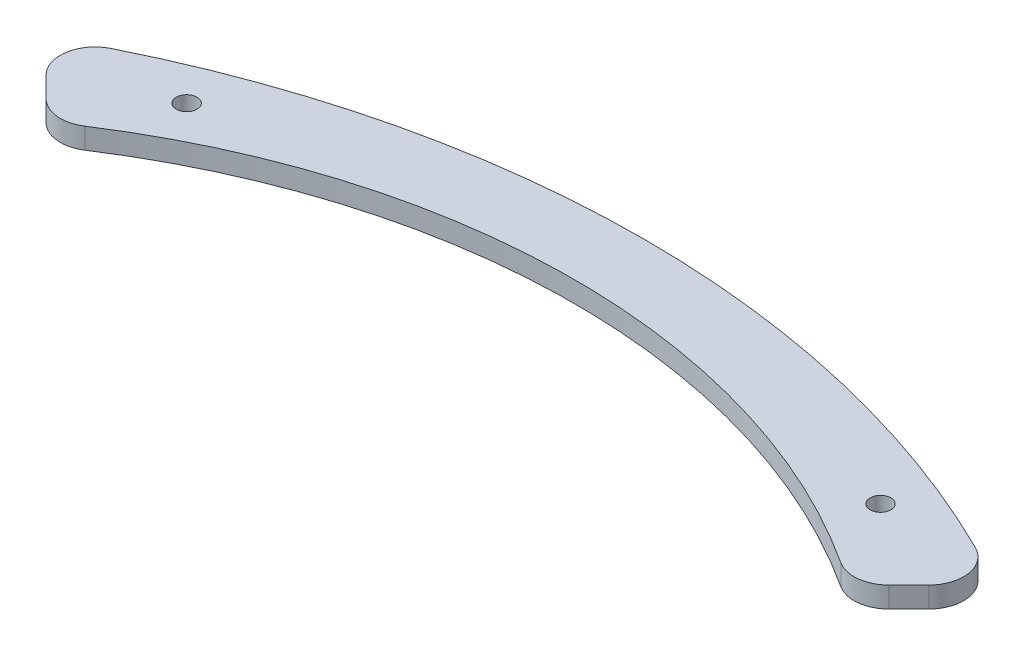
ISO-10303-21;
HEADER;
FILE_DESCRIPTION(('STEP AP214'),'2;1');
FILE_NAME('part.step','',(''),(''),'','','');
FILE_SCHEMA(('AUTOMOTIVE_DESIGN { 1 0 10303 214 1 1 1 1 }'));
ENDSEC;
DATA;
#1=APPLICATION_CONTEXT('core data for automotive mechanical design processes');
#2=APPLICATION_PROTOCOL_DEFINITION('international standard','automotive_design',2000,#1);
#3=PRODUCT_CONTEXT('',#1,'mechanical');
#4=PRODUCT('Part','Part','',(#3));
#5=PRODUCT_RELATED_PRODUCT_CATEGORY('part','',(#4));
#6=PRODUCT_DEFINITION_FORMATION('','',#4);
#7=PRODUCT_DEFINITION_CONTEXT('part definition',#1,'design');
#8=PRODUCT_DEFINITION('design','',#6,#7);
#9=PRODUCT_DEFINITION_SHAPE('','',#8);
#10=(LENGTH_UNIT() NAMED_UNIT(*) SI_UNIT(.MILLI.,.METRE.));
#11=(NAMED_UNIT(*) PLANE_ANGLE_UNIT() SI_UNIT($,.RADIAN.));
#12=(NAMED_UNIT(*) SI_UNIT($,.STERADIAN.) SOLID_ANGLE_UNIT());
#13=UNCERTAINTY_MEASURE_WITH_UNIT(LENGTH_MEASURE(1.E-05),#10,'distance_accuracy_value','');
#14=(GEOMETRIC_REPRESENTATION_CONTEXT(3) GLOBAL_UNCERTAINTY_ASSIGNED_CONTEXT((#13)) GLOBAL_UNIT_ASSIGNED_CONTEXT((#10,
#11,#12)) REPRESENTATION_CONTEXT('',''));
#15=CARTESIAN_POINT('',(0.,0.,0.));
#16=DIRECTION('',(0.,0.,1.));
#17=DIRECTION('',(1.,0.,0.));
#18=AXIS2_PLACEMENT_3D('',#15,#16,#17);
#19=CARTESIAN_POINT('',(0.,3.,0.));
#20=DIRECTION('',(0.,-1.,0.));
#21=DIRECTION('',(0.,0.,-1.));
#22=AXIS2_PLACEMENT_3D('',#19,#20,#21);
#23=CYLINDRICAL_SURFACE('',#22,140.);
#24=CARTESIAN_POINT('',(0.,3.,0.));
#25=DIRECTION('',(0.,1.,0.));
#26=DIRECTION('',(0.,0.,-1.));
#27=AXIS2_PLACEMENT_3D('',#24,#25,#26);
#28=CIRCLE('',#27,140.);
#29=CARTESIAN_POINT('',(62.3072350090684,3.,-125.370684234891));
#30=VERTEX_POINT('',#29);
#31=CARTESIAN_POINT('',(-62.3072350090685,3.,-125.370684234891));
#32=VERTEX_POINT('',#31);
#33=EDGE_CURVE('E118',#30,#32,#28,.T.);
#34=ORIENTED_EDGE('',*,*,#33,.F.);
#35=DIRECTION('',(0.,-1.,0.));
#36=VECTOR('',#35,1.);
#37=CARTESIAN_POINT('',(62.3072350090683,3.,-125.370684234891));
#38=LINE('',#37,#36);
#39=CARTESIAN_POINT('',(62.3072350090684,0.,-125.370684234891));
#40=VERTEX_POINT('',#39);
#41=EDGE_CURVE('E103',#30,#40,#38,.T.);
#42=ORIENTED_EDGE('',*,*,#41,.T.);
#43=CARTESIAN_POINT('',(0.,0.,0.));
#44=DIRECTION('',(0.,1.,0.));
#45=DIRECTION('',(0.,0.,-1.));
#46=AXIS2_PLACEMENT_3D('',#43,#44,#45);
#47=CIRCLE('',#46,140.);
#48=CARTESIAN_POINT('',(-62.3072350090685,0.,-125.370684234891));
#49=VERTEX_POINT('',#48);
#50=EDGE_CURVE('E115',#40,#49,#47,.T.);
#51=ORIENTED_EDGE('',*,*,#50,.T.);
#52=DIRECTION('',(0.,-1.,0.));
#53=VECTOR('',#52,1.);
#54=CARTESIAN_POINT('',(-62.3072350090685,3.,-125.370684234891));
#55=LINE('',#54,#53);
#56=EDGE_CURVE('E120',#49,#32,#55,.F.);
#57=ORIENTED_EDGE('',*,*,#56,.T.);
#58=EDGE_LOOP('',(#34,#42,#51,#57));
#59=FACE_BOUND('',#58,.T.);
#60=ADVANCED_FACE('F32',(#59),#23,.T.);
#61=CARTESIAN_POINT('',(-68.4084813465316,3.,-122.148596716709));
#62=DIRECTION('',(0.707106781186547,0.,-0.707106781186547));
#63=DIRECTION('',(-0.707106781186548,0.,-0.707106781186548));
#64=AXIS2_PLACEMENT_3D('',#61,#62,#63);
#65=PLANE('',#64);
#66=DIRECTION('',(0.707106781186548,0.,0.707106781186548));
#67=VECTOR('',#66,1.);
#68=CARTESIAN_POINT('',(-68.4084813465316,3.,-122.148596716709));
#69=LINE('',#68,#67);
#70=CARTESIAN_POINT('',(-63.6175105218202,3.,-117.357625891998));
#71=VERTEX_POINT('',#70);
#72=CARTESIAN_POINT('',(-60.7237103959211,3.,-114.463825766099));
#73=VERTEX_POINT('',#72);
#74=EDGE_CURVE('E162',#71,#73,#69,.T.);
#75=ORIENTED_EDGE('',*,*,#74,.F.);
#76=DIRECTION('',(0.,-1.,0.));
#77=VECTOR('',#76,1.);
#78=CARTESIAN_POINT('',(-63.6175105218202,3.,-117.357625891998));
#79=LINE('',#78,#77);
#80=CARTESIAN_POINT('',(-63.6175105218202,0.,-117.357625891998));
#81=VERTEX_POINT('',#80);
#82=EDGE_CURVE('E11',#71,#81,#79,.T.);
#83=ORIENTED_EDGE('',*,*,#82,.T.);
#84=DIRECTION('',(0.707106781186548,0.,0.707106781186548));
#85=VECTOR('',#84,1.);
#86=CARTESIAN_POINT('',(-68.4084813465316,0.,-122.148596716709));
#87=LINE('',#86,#85);
#88=CARTESIAN_POINT('',(-60.7237103959211,0.,-114.463825766099));
#89=VERTEX_POINT('',#88);
#90=EDGE_CURVE('E125',#81,#89,#87,.T.);
#91=ORIENTED_EDGE('',*,*,#90,.T.);
#92=DIRECTION('',(0.,-1.,0.));
#93=VECTOR('',#92,1.);
#94=CARTESIAN_POINT('',(-60.7237103959211,3.,-114.463825766099));
#95=LINE('',#94,#93);
#96=EDGE_CURVE('E40',#89,#73,#95,.F.);
#97=ORIENTED_EDGE('',*,*,#96,.T.);
#98=EDGE_LOOP('',(#75,#83,#91,#97));
#99=FACE_BOUND('',#98,.T.);
#100=ADVANCED_FACE('F161',(#99),#65,.F.);
#101=CARTESIAN_POINT('',(0.,3.,-29.9396499873524));
#102=DIRECTION('',(0.,-1.,0.));
#103=DIRECTION('',(0.,0.,-1.));
#104=AXIS2_PLACEMENT_3D('',#101,#102,#103);
#105=CYLINDRICAL_SURFACE('',#104,100.);
#106=CARTESIAN_POINT('',(0.,0.,-29.9396499873524));
#107=DIRECTION('',(0.,-1.,0.));
#108=DIRECTION('',(0.,0.,-1.));
#109=AXIS2_PLACEMENT_3D('',#106,#107,#108);
#110=CIRCLE('',#109,100.);
#111=CARTESIAN_POINT('',(-54.4649299904651,0.,-113.806040163237));
#112=VERTEX_POINT('',#111);
#113=CARTESIAN_POINT('',(54.4649299904651,0.,-113.806040163237));
#114=VERTEX_POINT('',#113);
#115=EDGE_CURVE('E129',#112,#114,#110,.T.);
#116=ORIENTED_EDGE('',*,*,#115,.T.);
#117=DIRECTION('',(0.,-1.,0.));
#118=VECTOR('',#117,1.);
#119=CARTESIAN_POINT('',(54.4649299904651,3.,-113.806040163237));
#120=LINE('',#119,#118);
#121=CARTESIAN_POINT('',(54.4649299904651,3.,-113.806040163237));
#122=VERTEX_POINT('',#121);
#123=EDGE_CURVE('E47',#114,#122,#120,.F.);
#124=ORIENTED_EDGE('',*,*,#123,.T.);
#125=CARTESIAN_POINT('',(0.,3.,-29.9396499873524));
#126=DIRECTION('',(0.,-1.,0.));
#127=DIRECTION('',(0.,0.,-1.));
#128=AXIS2_PLACEMENT_3D('',#125,#126,#127);
#129=CIRCLE('',#128,100.);
#130=CARTESIAN_POINT('',(-54.4649299904651,3.,-113.806040163237));
#131=VERTEX_POINT('',#130);
#132=EDGE_CURVE('E168',#131,#122,#129,.T.);
#133=ORIENTED_EDGE('',*,*,#132,.F.);
#134=DIRECTION('',(0.,-1.,0.));
#135=VECTOR('',#134,1.);
#136=CARTESIAN_POINT('',(-54.4649299904651,3.,-113.806040163237));
#137=LINE('',#136,#135);
#138=EDGE_CURVE('E155',#131,#112,#137,.T.);
#139=ORIENTED_EDGE('',*,*,#138,.T.);
#140=EDGE_LOOP('',(#116,#124,#133,#139));
#141=FACE_BOUND('',#140,.T.);
#142=ADVANCED_FACE('F172',(#141),#105,.F.);
#143=CARTESIAN_POINT('',(68.4084813465315,3.,-122.148596716709));
#144=DIRECTION('',(-0.707106781186549,0.,-0.707106781186546));
#145=DIRECTION('',(-0.707106781186546,0.,0.707106781186549));
#146=AXIS2_PLACEMENT_3D('',#143,#144,#145);
#147=PLANE('',#146);
#148=DIRECTION('',(0.707106781186546,0.,-0.707106781186549));
#149=VECTOR('',#148,1.);
#150=CARTESIAN_POINT('',(68.4084813465315,0.,-122.148596716709));
#151=LINE('',#150,#149);
#152=CARTESIAN_POINT('',(60.723710395921,0.,-114.463825766099));
#153=VERTEX_POINT('',#152);
#154=CARTESIAN_POINT('',(63.6175105218201,0.,-117.357625891998));
#155=VERTEX_POINT('',#154);
#156=EDGE_CURVE('E139',#153,#155,#151,.T.);
#157=ORIENTED_EDGE('',*,*,#156,.T.);
#158=DIRECTION('',(0.,-1.,0.));
#159=VECTOR('',#158,1.);
#160=CARTESIAN_POINT('',(63.6175105218201,3.,-117.357625891998));
#161=LINE('',#160,#159);
#162=CARTESIAN_POINT('',(63.6175105218201,3.,-117.357625891998));
#163=VERTEX_POINT('',#162);
#164=EDGE_CURVE('E104',#155,#163,#161,.F.);
#165=ORIENTED_EDGE('',*,*,#164,.T.);
#166=DIRECTION('',(0.707106781186546,0.,-0.707106781186549));
#167=VECTOR('',#166,1.);
#168=CARTESIAN_POINT('',(68.4084813465315,3.,-122.148596716709));
#169=LINE('',#168,#167);
#170=CARTESIAN_POINT('',(60.723710395921,3.,-114.463825766099));
#171=VERTEX_POINT('',#170);
#172=EDGE_CURVE('E135',#171,#163,#169,.T.);
#173=ORIENTED_EDGE('',*,*,#172,.F.);
#174=DIRECTION('',(0.,-1.,0.));
#175=VECTOR('',#174,1.);
#176=CARTESIAN_POINT('',(60.723710395921,3.,-114.463825766099));
#177=LINE('',#176,#175);
#178=EDGE_CURVE('E109',#171,#153,#177,.T.);
#179=ORIENTED_EDGE('',*,*,#178,.T.);
#180=EDGE_LOOP('',(#157,#165,#173,#179));
#181=FACE_BOUND('',#180,.T.);
#182=ADVANCED_FACE('F179',(#181),#147,.F.);
#183=CARTESIAN_POINT('',(0.,3.,0.));
#184=DIRECTION('',(0.,-1.,0.));
#185=DIRECTION('',(0.,0.,-1.));
#186=AXIS2_PLACEMENT_3D('',#183,#184,#185);
#187=PLANE('',#186);
#188=CARTESIAN_POINT('',(50.,3.,-124.));
#189=DIRECTION('',(0.,1.,0.));
#190=DIRECTION('',(0.,0.,1.));
#191=AXIS2_PLACEMENT_3D('',#188,#189,#190);
#192=CIRCLE('',#191,1.5);
#193=CARTESIAN_POINT('',(50.,3.,-122.5));
#194=VERTEX_POINT('',#193);
#195=EDGE_CURVE('E183',#194,#194,#192,.T.);
#196=ORIENTED_EDGE('',*,*,#195,.F.);
#197=EDGE_LOOP('',(#196));
#198=FACE_BOUND('',#197,.T.);
#199=CARTESIAN_POINT('',(-50.,3.,-124.));
#200=DIRECTION('',(0.,1.,0.));
#201=DIRECTION('',(0.,0.,1.));
#202=AXIS2_PLACEMENT_3D('',#199,#200,#201);
#203=CIRCLE('',#202,1.5);
#204=CARTESIAN_POINT('',(-50.,3.,-122.5));
#205=VERTEX_POINT('',#204);
#206=EDGE_CURVE('E126',#205,#205,#203,.T.);
#207=ORIENTED_EDGE('',*,*,#206,.F.);
#208=EDGE_LOOP('',(#207));
#209=FACE_BOUND('',#208,.T.);
#210=ORIENTED_EDGE('',*,*,#172,.T.);
#211=CARTESIAN_POINT('',(60.0819766158873,3.,-120.89315979793));
#212=DIRECTION('',(0.,-1.,0.));
#213=DIRECTION('',(0.,0.,-1.));
#214=AXIS2_PLACEMENT_3D('',#211,#212,#213);
#215=CIRCLE('',#214,5.);
#216=EDGE_CURVE('E153',#163,#30,#215,.F.);
#217=ORIENTED_EDGE('',*,*,#216,.T.);
#218=ORIENTED_EDGE('',*,*,#33,.T.);
#219=CARTESIAN_POINT('',(-60.0819766158874,3.,-120.89315979793));
#220=DIRECTION('',(0.,-1.,0.));
#221=DIRECTION('',(0.,0.,-1.));
#222=AXIS2_PLACEMENT_3D('',#219,#220,#221);
#223=CIRCLE('',#222,5.);
#224=EDGE_CURVE('E149',#32,#71,#223,.F.);
#225=ORIENTED_EDGE('',*,*,#224,.T.);
#226=ORIENTED_EDGE('',*,*,#74,.T.);
#227=CARTESIAN_POINT('',(-57.1881764899884,3.,-117.999359672031));
#228=DIRECTION('',(0.,-1.,0.));
#229=DIRECTION('',(0.,0.,-1.));
#230=AXIS2_PLACEMENT_3D('',#227,#228,#229);
#231=CIRCLE('',#230,5.);
#232=EDGE_CURVE('E54',#73,#131,#231,.F.);
#233=ORIENTED_EDGE('',*,*,#232,.T.);
#234=ORIENTED_EDGE('',*,*,#132,.T.);
#235=CARTESIAN_POINT('',(57.1881764899883,3.,-117.999359672031));
#236=DIRECTION('',(0.,-1.,0.));
#237=DIRECTION('',(0.,0.,-1.));
#238=AXIS2_PLACEMENT_3D('',#235,#236,#237);
#239=CIRCLE('',#238,5.);
#240=EDGE_CURVE('E151',#122,#171,#239,.F.);
#241=ORIENTED_EDGE('',*,*,#240,.T.);
#242=EDGE_LOOP('',(#210,#217,#218,#225,#226,#233,#234,#241));
#243=FACE_BOUND('',#242,.T.);
#244=ADVANCED_FACE('F166',(#198,#209,#243),#187,.F.);
#245=CARTESIAN_POINT('',(0.,0.,0.));
#246=DIRECTION('',(0.,-1.,0.));
#247=DIRECTION('',(0.,0.,-1.));
#248=AXIS2_PLACEMENT_3D('',#245,#246,#247);
#249=PLANE('',#248);
#250=CARTESIAN_POINT('',(50.,0.,-124.));
#251=DIRECTION('',(0.,-1.,0.));
#252=DIRECTION('',(0.,0.,-1.));
#253=AXIS2_PLACEMENT_3D('',#250,#251,#252);
#254=CIRCLE('',#253,1.5);
#255=CARTESIAN_POINT('',(50.,0.,-122.5));
#256=VERTEX_POINT('',#255);
#257=EDGE_CURVE('E185',#256,#256,#254,.F.);
#258=ORIENTED_EDGE('',*,*,#257,.T.);
#259=EDGE_LOOP('',(#258));
#260=FACE_BOUND('',#259,.T.);
#261=CARTESIAN_POINT('',(-50.,0.,-124.));
#262=DIRECTION('',(0.,-1.,0.));
#263=DIRECTION('',(0.,0.,-1.));
#264=AXIS2_PLACEMENT_3D('',#261,#262,#263);
#265=CIRCLE('',#264,1.5);
#266=CARTESIAN_POINT('',(-50.,0.,-122.5));
#267=VERTEX_POINT('',#266);
#268=EDGE_CURVE('E132',#267,#267,#265,.F.);
#269=ORIENTED_EDGE('',*,*,#268,.T.);
#270=EDGE_LOOP('',(#269));
#271=FACE_BOUND('',#270,.T.);
#272=ORIENTED_EDGE('',*,*,#50,.F.);
#273=CARTESIAN_POINT('',(60.0819766158873,0.,-120.89315979793));
#274=DIRECTION('',(0.,-1.,0.));
#275=DIRECTION('',(0.,0.,-1.));
#276=AXIS2_PLACEMENT_3D('',#273,#274,#275);
#277=CIRCLE('',#276,5.);
#278=EDGE_CURVE('E99',#40,#155,#277,.T.);
#279=ORIENTED_EDGE('',*,*,#278,.T.);
#280=ORIENTED_EDGE('',*,*,#156,.F.);
#281=CARTESIAN_POINT('',(57.1881764899883,0.,-117.999359672031));
#282=DIRECTION('',(0.,-1.,0.));
#283=DIRECTION('',(0.,0.,-1.));
#284=AXIS2_PLACEMENT_3D('',#281,#282,#283);
#285=CIRCLE('',#284,5.);
#286=EDGE_CURVE('E110',#153,#114,#285,.T.);
#287=ORIENTED_EDGE('',*,*,#286,.T.);
#288=ORIENTED_EDGE('',*,*,#115,.F.);
#289=CARTESIAN_POINT('',(-57.1881764899884,0.,-117.999359672031));
#290=DIRECTION('',(0.,-1.,0.));
#291=DIRECTION('',(0.,0.,-1.));
#292=AXIS2_PLACEMENT_3D('',#289,#290,#291);
#293=CIRCLE('',#292,5.);
#294=EDGE_CURVE('E119',#112,#89,#293,.T.);
#295=ORIENTED_EDGE('',*,*,#294,.T.);
#296=ORIENTED_EDGE('',*,*,#90,.F.);
#297=CARTESIAN_POINT('',(-60.0819766158874,0.,-120.89315979793));
#298=DIRECTION('',(0.,-1.,0.));
#299=DIRECTION('',(0.,0.,-1.));
#300=AXIS2_PLACEMENT_3D('',#297,#298,#299);
#301=CIRCLE('',#300,5.);
#302=EDGE_CURVE('E124',#81,#49,#301,.T.);
#303=ORIENTED_EDGE('',*,*,#302,.T.);
#304=EDGE_LOOP('',(#272,#279,#280,#287,#288,#295,#296,#303));
#305=FACE_BOUND('',#304,.T.);
#306=ADVANCED_FACE('F122',(#260,#271,#305),#249,.T.);
#307=CARTESIAN_POINT('',(60.0819766158873,3.,-120.89315979793));
#308=DIRECTION('',(0.,-1.,0.));
#309=DIRECTION('',(0.,0.,-1.));
#310=AXIS2_PLACEMENT_3D('',#307,#308,#309);
#311=CYLINDRICAL_SURFACE('',#310,5.);
#312=ORIENTED_EDGE('',*,*,#216,.F.);
#313=ORIENTED_EDGE('',*,*,#164,.F.);
#314=ORIENTED_EDGE('',*,*,#278,.F.);
#315=ORIENTED_EDGE('',*,*,#41,.F.);
#316=EDGE_LOOP('',(#312,#313,#314,#315));
#317=FACE_BOUND('',#316,.T.);
#318=ADVANCED_FACE('F102',(#317),#311,.T.);
#319=CARTESIAN_POINT('',(57.1881764899883,3.,-117.999359672031));
#320=DIRECTION('',(0.,-1.,0.));
#321=DIRECTION('',(0.,0.,-1.));
#322=AXIS2_PLACEMENT_3D('',#319,#320,#321);
#323=CYLINDRICAL_SURFACE('',#322,5.);
#324=ORIENTED_EDGE('',*,*,#240,.F.);
#325=ORIENTED_EDGE('',*,*,#123,.F.);
#326=ORIENTED_EDGE('',*,*,#286,.F.);
#327=ORIENTED_EDGE('',*,*,#178,.F.);
#328=EDGE_LOOP('',(#324,#325,#326,#327));
#329=FACE_BOUND('',#328,.T.);
#330=ADVANCED_FACE('F176',(#329),#323,.T.);
#331=CARTESIAN_POINT('',(-60.0819766158874,3.,-120.89315979793));
#332=DIRECTION('',(0.,-1.,0.));
#333=DIRECTION('',(0.,0.,-1.));
#334=AXIS2_PLACEMENT_3D('',#331,#332,#333);
#335=CYLINDRICAL_SURFACE('',#334,5.);
#336=ORIENTED_EDGE('',*,*,#224,.F.);
#337=ORIENTED_EDGE('',*,*,#56,.F.);
#338=ORIENTED_EDGE('',*,*,#302,.F.);
#339=ORIENTED_EDGE('',*,*,#82,.F.);
#340=EDGE_LOOP('',(#336,#337,#338,#339));
#341=FACE_BOUND('',#340,.T.);
#342=ADVANCED_FACE('F208',(#341),#335,.T.);
#343=CARTESIAN_POINT('',(-57.1881764899884,3.,-117.999359672031));
#344=DIRECTION('',(0.,-1.,0.));
#345=DIRECTION('',(0.,0.,-1.));
#346=AXIS2_PLACEMENT_3D('',#343,#344,#345);
#347=CYLINDRICAL_SURFACE('',#346,5.);
#348=ORIENTED_EDGE('',*,*,#232,.F.);
#349=ORIENTED_EDGE('',*,*,#96,.F.);
#350=ORIENTED_EDGE('',*,*,#294,.F.);
#351=ORIENTED_EDGE('',*,*,#138,.F.);
#352=EDGE_LOOP('',(#348,#349,#350,#351));
#353=FACE_BOUND('',#352,.T.);
#354=ADVANCED_FACE('F34',(#353),#347,.T.);
#355=CARTESIAN_POINT('',(-50.,-0.00100000000000013,-124.));
#356=DIRECTION('',(0.,1.,0.));
#357=DIRECTION('',(0.,0.,1.));
#358=AXIS2_PLACEMENT_3D('',#355,#356,#357);
#359=CYLINDRICAL_SURFACE('',#358,1.5);
#360=CARTESIAN_POINT('',(-50.,0.,-122.5));
#361=CARTESIAN_POINT('',(-50.,0.03125,-122.5));
#362=CARTESIAN_POINT('',(-50.,0.0625,-122.5));
#363=CARTESIAN_POINT('',(-50.,0.125,-122.5));
#364=CARTESIAN_POINT('',(-50.,0.15625,-122.5));
#365=CARTESIAN_POINT('',(-50.,0.21875,-122.5));
#366=CARTESIAN_POINT('',(-50.,0.25,-122.5));
#367=CARTESIAN_POINT('',(-50.,0.3125,-122.5));
#368=CARTESIAN_POINT('',(-50.,0.34375,-122.5));
#369=CARTESIAN_POINT('',(-50.,0.40625,-122.5));
#370=CARTESIAN_POINT('',(-50.,0.4375,-122.5));
#371=CARTESIAN_POINT('',(-50.,0.5,-122.5));
#372=CARTESIAN_POINT('',(-50.,0.53125,-122.5));
#373=CARTESIAN_POINT('',(-50.,0.59375,-122.5));
#374=CARTESIAN_POINT('',(-50.,0.625,-122.5));
#375=CARTESIAN_POINT('',(-50.,0.6875,-122.5));
#376=CARTESIAN_POINT('',(-50.,0.71875,-122.5));
#377=CARTESIAN_POINT('',(-50.,0.78125,-122.5));
#378=CARTESIAN_POINT('',(-50.,0.8125,-122.5));
#379=CARTESIAN_POINT('',(-50.,0.875,-122.5));
#380=CARTESIAN_POINT('',(-50.,0.90625,-122.5));
#381=CARTESIAN_POINT('',(-50.,0.96875,-122.5));
#382=CARTESIAN_POINT('',(-50.,1.,-122.5));
#383=CARTESIAN_POINT('',(-50.,1.0625,-122.5));
#384=CARTESIAN_POINT('',(-50.,1.09375,-122.5));
#385=CARTESIAN_POINT('',(-50.,1.15625,-122.5));
#386=CARTESIAN_POINT('',(-50.,1.1875,-122.5));
#387=CARTESIAN_POINT('',(-50.,1.25,-122.5));
#388=CARTESIAN_POINT('',(-50.,1.28125,-122.5));
#389=CARTESIAN_POINT('',(-50.,1.34375,-122.5));
#390=CARTESIAN_POINT('',(-50.,1.375,-122.5));
#391=CARTESIAN_POINT('',(-50.,1.4375,-122.5));
#392=CARTESIAN_POINT('',(-50.,1.46875,-122.5));
#393=CARTESIAN_POINT('',(-50.,1.53125,-122.5));
#394=CARTESIAN_POINT('',(-50.,1.5625,-122.5));
#395=CARTESIAN_POINT('',(-50.,1.625,-122.5));
#396=CARTESIAN_POINT('',(-50.,1.65625,-122.5));
#397=CARTESIAN_POINT('',(-50.,1.71875,-122.5));
#398=CARTESIAN_POINT('',(-50.,1.75,-122.5));
#399=CARTESIAN_POINT('',(-50.,1.8125,-122.5));
#400=CARTESIAN_POINT('',(-50.,1.84375,-122.5));
#401=CARTESIAN_POINT('',(-50.,1.90625,-122.5));
#402=CARTESIAN_POINT('',(-50.,1.9375,-122.5));
#403=CARTESIAN_POINT('',(-50.,2.,-122.5));
#404=CARTESIAN_POINT('',(-50.,2.03125,-122.5));
#405=CARTESIAN_POINT('',(-50.,2.09375,-122.5));
#406=CARTESIAN_POINT('',(-50.,2.125,-122.5));
#407=CARTESIAN_POINT('',(-50.,2.1875,-122.5));
#408=CARTESIAN_POINT('',(-50.,2.21875,-122.5));
#409=CARTESIAN_POINT('',(-50.,2.28125,-122.5));
#410=CARTESIAN_POINT('',(-50.,2.3125,-122.5));
#411=CARTESIAN_POINT('',(-50.,2.375,-122.5));
#412=CARTESIAN_POINT('',(-50.,2.40625,-122.5));
#413=CARTESIAN_POINT('',(-50.,2.46875,-122.5));
#414=CARTESIAN_POINT('',(-50.,2.5,-122.5));
#415=CARTESIAN_POINT('',(-50.,2.5625,-122.5));
#416=CARTESIAN_POINT('',(-50.,2.59375,-122.5));
#417=CARTESIAN_POINT('',(-50.,2.65625,-122.5));
#418=CARTESIAN_POINT('',(-50.,2.6875,-122.5));
#419=CARTESIAN_POINT('',(-50.,2.75,-122.5));
#420=CARTESIAN_POINT('',(-50.,2.78125,-122.5));
#421=CARTESIAN_POINT('',(-50.,2.84375,-122.5));
#422=CARTESIAN_POINT('',(-50.,2.875,-122.5));
#423=CARTESIAN_POINT('',(-50.,2.9375,-122.5));
#424=CARTESIAN_POINT('',(-50.,2.96875,-122.5));
#425=CARTESIAN_POINT('',(-50.,3.,-122.5));
#426=B_SPLINE_CURVE_WITH_KNOTS('',3,(#360,#361,#362,#363,#364,#365,#366,#367,#368,#369,#370,
#371,#372,#373,#374,#375,#376,#377,#378,#379,#380,#381,#382,#383,#384,#385,#386,#387,#388,#389,
#390,#391,#392,#393,#394,#395,#396,#397,#398,#399,#400,#401,#402,#403,#404,#405,#406,#407,#408,
#409,#410,#411,#412,#413,#414,#415,#416,#417,#418,#419,#420,#421,#422,#423,#424,#425),
.UNSPECIFIED.,.F.,.F.,(4,2,2,2,2,2,2,2,2,2,2,2,2,2,2,2,2,2,2,2,2,2,2,2,2,2,2,2,2,2,2,2,4),(0.,
0.09375,0.1875,0.28125,0.375,0.46875,0.5625,0.65625,0.75,0.84375,0.9375,1.03125,1.125,1.21875,
1.3125,1.40625,1.5,1.59375,1.6875,1.78125,1.875,1.96875,2.0625,2.15625,2.25,2.34375,2.4375,
2.53125,2.625,2.71875,2.8125,2.90625,3.),.UNSPECIFIED.);
#427=EDGE_CURVE('BSEAM198',#267,#205,#426,.T.);
#428=ORIENTED_EDGE('',*,*,#268,.F.);
#429=ORIENTED_EDGE('',*,*,#206,.T.);
#430=ORIENTED_EDGE('',*,*,#427,.T.);
#431=ORIENTED_EDGE('',*,*,#427,.F.);
#432=EDGE_LOOP('',(#428,#430,#429,#431));
#433=FACE_BOUND('',#432,.T.);
#434=ADVANCED_FACE('F198',(#433),#359,.F.);
#435=CARTESIAN_POINT('',(50.,-0.00100000000000013,-124.));
#436=DIRECTION('',(0.,1.,0.));
#437=DIRECTION('',(0.,0.,1.));
#438=AXIS2_PLACEMENT_3D('',#435,#436,#437);
#439=CYLINDRICAL_SURFACE('',#438,1.5);
#440=CARTESIAN_POINT('',(50.,0.,-122.5));
#441=CARTESIAN_POINT('',(50.,0.03125,-122.5));
#442=CARTESIAN_POINT('',(50.,0.0625,-122.5));
#443=CARTESIAN_POINT('',(50.,0.125,-122.5));
#444=CARTESIAN_POINT('',(50.,0.15625,-122.5));
#445=CARTESIAN_POINT('',(50.,0.21875,-122.5));
#446=CARTESIAN_POINT('',(50.,0.25,-122.5));
#447=CARTESIAN_POINT('',(50.,0.3125,-122.5));
#448=CARTESIAN_POINT('',(50.,0.34375,-122.5));
#449=CARTESIAN_POINT('',(50.,0.40625,-122.5));
#450=CARTESIAN_POINT('',(50.,0.4375,-122.5));
#451=CARTESIAN_POINT('',(50.,0.5,-122.5));
#452=CARTESIAN_POINT('',(50.,0.53125,-122.5));
#453=CARTESIAN_POINT('',(50.,0.59375,-122.5));
#454=CARTESIAN_POINT('',(50.,0.625,-122.5));
#455=CARTESIAN_POINT('',(50.,0.6875,-122.5));
#456=CARTESIAN_POINT('',(50.,0.71875,-122.5));
#457=CARTESIAN_POINT('',(50.,0.78125,-122.5));
#458=CARTESIAN_POINT('',(50.,0.8125,-122.5));
#459=CARTESIAN_POINT('',(50.,0.875,-122.5));
#460=CARTESIAN_POINT('',(50.,0.90625,-122.5));
#461=CARTESIAN_POINT('',(50.,0.96875,-122.5));
#462=CARTESIAN_POINT('',(50.,1.,-122.5));
#463=CARTESIAN_POINT('',(50.,1.0625,-122.5));
#464=CARTESIAN_POINT('',(50.,1.09375,-122.5));
#465=CARTESIAN_POINT('',(50.,1.15625,-122.5));
#466=CARTESIAN_POINT('',(50.,1.1875,-122.5));
#467=CARTESIAN_POINT('',(50.,1.25,-122.5));
#468=CARTESIAN_POINT('',(50.,1.28125,-122.5));
#469=CARTESIAN_POINT('',(50.,1.34375,-122.5));
#470=CARTESIAN_POINT('',(50.,1.375,-122.5));
#471=CARTESIAN_POINT('',(50.,1.4375,-122.5));
#472=CARTESIAN_POINT('',(50.,1.46875,-122.5));
#473=CARTESIAN_POINT('',(50.,1.53125,-122.5));
#474=CARTESIAN_POINT('',(50.,1.5625,-122.5));
#475=CARTESIAN_POINT('',(50.,1.625,-122.5));
#476=CARTESIAN_POINT('',(50.,1.65625,-122.5));
#477=CARTESIAN_POINT('',(50.,1.71875,-122.5));
#478=CARTESIAN_POINT('',(50.,1.75,-122.5));
#479=CARTESIAN_POINT('',(50.,1.8125,-122.5));
#480=CARTESIAN_POINT('',(50.,1.84375,-122.5));
#481=CARTESIAN_POINT('',(50.,1.90625,-122.5));
#482=CARTESIAN_POINT('',(50.,1.9375,-122.5));
#483=CARTESIAN_POINT('',(50.,2.,-122.5));
#484=CARTESIAN_POINT('',(50.,2.03125,-122.5));
#485=CARTESIAN_POINT('',(50.,2.09375,-122.5));
#486=CARTESIAN_POINT('',(50.,2.125,-122.5));
#487=CARTESIAN_POINT('',(50.,2.1875,-122.5));
#488=CARTESIAN_POINT('',(50.,2.21875,-122.5));
#489=CARTESIAN_POINT('',(50.,2.28125,-122.5));
#490=CARTESIAN_POINT('',(50.,2.3125,-122.5));
#491=CARTESIAN_POINT('',(50.,2.375,-122.5));
#492=CARTESIAN_POINT('',(50.,2.40625,-122.5));
#493=CARTESIAN_POINT('',(50.,2.46875,-122.5));
#494=CARTESIAN_POINT('',(50.,2.5,-122.5));
#495=CARTESIAN_POINT('',(50.,2.5625,-122.5));
#496=CARTESIAN_POINT('',(50.,2.59375,-122.5));
#497=CARTESIAN_POINT('',(50.,2.65625,-122.5));
#498=CARTESIAN_POINT('',(50.,2.6875,-122.5));
#499=CARTESIAN_POINT('',(50.,2.75,-122.5));
#500=CARTESIAN_POINT('',(50.,2.78125,-122.5));
#501=CARTESIAN_POINT('',(50.,2.84375,-122.5));
#502=CARTESIAN_POINT('',(50.,2.875,-122.5));
#503=CARTESIAN_POINT('',(50.,2.9375,-122.5));
#504=CARTESIAN_POINT('',(50.,2.96875,-122.5));
#505=CARTESIAN_POINT('',(50.,3.,-122.5));
#506=B_SPLINE_CURVE_WITH_KNOTS('',3,(#440,#441,#442,#443,#444,#445,#446,#447,#448,#449,#450,
#451,#452,#453,#454,#455,#456,#457,#458,#459,#460,#461,#462,#463,#464,#465,#466,#467,#468,#469,
#470,#471,#472,#473,#474,#475,#476,#477,#478,#479,#480,#481,#482,#483,#484,#485,#486,#487,#488,
#489,#490,#491,#492,#493,#494,#495,#496,#497,#498,#499,#500,#501,#502,#503,#504,#505),
.UNSPECIFIED.,.F.,.F.,(4,2,2,2,2,2,2,2,2,2,2,2,2,2,2,2,2,2,2,2,2,2,2,2,2,2,2,2,2,2,2,2,4),(0.,
0.09375,0.1875,0.28125,0.375,0.46875,0.5625,0.65625,0.75,0.84375,0.9375,1.03125,1.125,1.21875,
1.3125,1.40625,1.5,1.59375,1.6875,1.78125,1.875,1.96875,2.0625,2.15625,2.25,2.34375,2.4375,
2.53125,2.625,2.71875,2.8125,2.90625,3.),.UNSPECIFIED.);
#507=EDGE_CURVE('BSEAM191',#256,#194,#506,.T.);
#508=ORIENTED_EDGE('',*,*,#257,.F.);
#509=ORIENTED_EDGE('',*,*,#195,.T.);
#510=ORIENTED_EDGE('',*,*,#507,.T.);
#511=ORIENTED_EDGE('',*,*,#507,.F.);
#512=EDGE_LOOP('',(#508,#510,#509,#511));
#513=FACE_BOUND('',#512,.T.);
#514=ADVANCED_FACE('F191',(#513),#439,.F.);
#515=CLOSED_SHELL('',(#60,#100,#142,#182,#244,#306,#318,#330,#342,#354,#434,#514));
#516=MANIFOLD_SOLID_BREP('B2',#515);
#517=ADVANCED_BREP_SHAPE_REPRESENTATION('',(#18,#516),#14);
#518=SHAPE_DEFINITION_REPRESENTATION(#9,#517);
ENDSEC;
END-ISO-10303-21;
